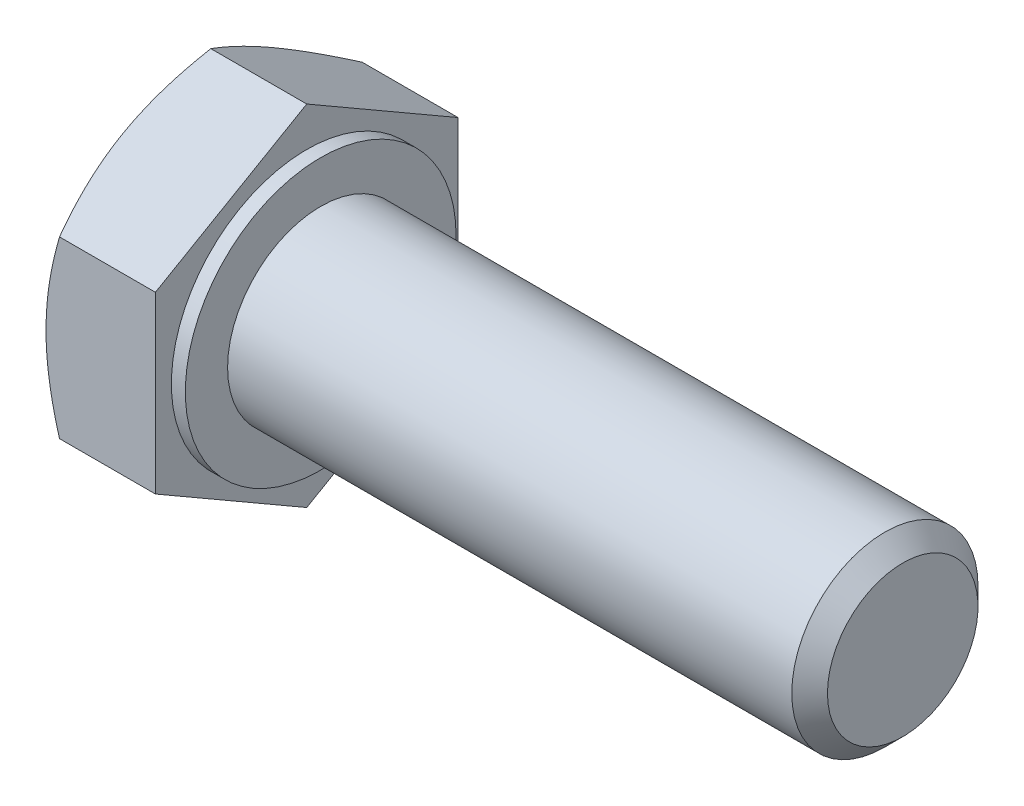
ISO-10303-21;
HEADER;
FILE_DESCRIPTION(('STEP AP214'),'2;1');
FILE_NAME('part.step','',(''),(''),'','','');
FILE_SCHEMA(('AUTOMOTIVE_DESIGN { 1 0 10303 214 1 1 1 1 }'));
ENDSEC;
DATA;
#1=APPLICATION_CONTEXT('core data for automotive mechanical design processes');
#2=APPLICATION_PROTOCOL_DEFINITION('international standard','automotive_design',2000,#1);
#3=PRODUCT_CONTEXT('',#1,'mechanical');
#4=PRODUCT('Part','Part','',(#3));
#5=PRODUCT_RELATED_PRODUCT_CATEGORY('part','',(#4));
#6=PRODUCT_DEFINITION_FORMATION('','',#4);
#7=PRODUCT_DEFINITION_CONTEXT('part definition',#1,'design');
#8=PRODUCT_DEFINITION('design','',#6,#7);
#9=PRODUCT_DEFINITION_SHAPE('','',#8);
#10=(LENGTH_UNIT() NAMED_UNIT(*) SI_UNIT(.MILLI.,.METRE.));
#11=(NAMED_UNIT(*) PLANE_ANGLE_UNIT() SI_UNIT($,.RADIAN.));
#12=(NAMED_UNIT(*) SI_UNIT($,.STERADIAN.) SOLID_ANGLE_UNIT());
#13=UNCERTAINTY_MEASURE_WITH_UNIT(LENGTH_MEASURE(1.E-05),#10,'distance_accuracy_value','');
#14=(GEOMETRIC_REPRESENTATION_CONTEXT(3) GLOBAL_UNCERTAINTY_ASSIGNED_CONTEXT((#13)) GLOBAL_UNIT_ASSIGNED_CONTEXT((#10,
#11,#12)) REPRESENTATION_CONTEXT('',''));
#15=CARTESIAN_POINT('',(0.,0.,0.));
#16=DIRECTION('',(0.,0.,1.));
#17=DIRECTION('',(1.,0.,0.));
#18=AXIS2_PLACEMENT_3D('',#15,#16,#17);
#19=CARTESIAN_POINT('',(25.,2.,0.));
#20=DIRECTION('',(1.,0.,0.));
#21=DIRECTION('',(0.,0.,-1.));
#22=AXIS2_PLACEMENT_3D('',#19,#20,#21);
#23=PLANE('',#22);
#24=CARTESIAN_POINT('',(25.0000000003184,0.,0.));
#25=DIRECTION('',(-1.,0.,0.));
#26=DIRECTION('',(0.,0.,1.));
#27=AXIS2_PLACEMENT_3D('',#24,#25,#26);
#28=CIRCLE('',#27,3.23318750037059);
#29=CARTESIAN_POINT('',(25.0000000003184,0.,3.23318750037059));
#30=VERTEX_POINT('',#29);
#31=EDGE_CURVE('E20',#30,#30,#28,.T.);
#32=ORIENTED_EDGE('',*,*,#31,.F.);
#33=EDGE_LOOP('',(#32));
#34=FACE_BOUND('',#33,.T.);
#35=ADVANCED_FACE('F16',(#34),#23,.T.);
#36=CARTESIAN_POINT('',(24.2330874998515,0.,0.));
#37=DIRECTION('',(-1.,0.,0.));
#38=DIRECTION('',(0.,0.,1.));
#39=AXIS2_PLACEMENT_3D('',#36,#37,#38);
#40=CONICAL_SURFACE('',#39,3.99999999945067,0.785332961756607);
#41=ORIENTED_EDGE('',*,*,#31,.T.);
#42=EDGE_LOOP('',(#41));
#43=FACE_BOUND('',#42,.T.);
#44=CARTESIAN_POINT('',(24.2330875,0.,0.));
#45=DIRECTION('',(1.,0.,0.));
#46=DIRECTION('',(0.,1.,0.));
#47=AXIS2_PLACEMENT_3D('',#44,#45,#46);
#48=CIRCLE('',#47,4.);
#49=CARTESIAN_POINT('',(24.2330875,4.,0.));
#50=VERTEX_POINT('',#49);
#51=EDGE_CURVE('E115',#50,#50,#48,.F.);
#52=ORIENTED_EDGE('',*,*,#51,.F.);
#53=EDGE_LOOP('',(#52));
#54=FACE_BOUND('',#53,.T.);
#55=ADVANCED_FACE('F290',(#43,#54),#40,.T.);
#56=CARTESIAN_POINT('',(-5.3001,0.,0.));
#57=DIRECTION('',(1.,0.,0.));
#58=DIRECTION('',(0.,0.,-1.));
#59=AXIS2_PLACEMENT_3D('',#56,#57,#58);
#60=PLANE('',#59);
#61=CARTESIAN_POINT('',(-5.30010000060163,0.,0.));
#62=DIRECTION('',(1.,0.,0.));
#63=DIRECTION('',(0.,0.,-1.));
#64=AXIS2_PLACEMENT_3D('',#61,#62,#63);
#65=CIRCLE('',#64,6.50000000034734);
#66=CARTESIAN_POINT('',(-5.3001000007019,5.62916512474925,-3.25000000008683));
#67=VERTEX_POINT('',#66);
#68=CARTESIAN_POINT('',(-5.3001000007019,5.62916512474925,3.25000000008684));
#69=VERTEX_POINT('',#68);
#70=EDGE_CURVE('E309',#67,#69,#65,.T.);
#71=ORIENTED_EDGE('',*,*,#70,.F.);
#72=CARTESIAN_POINT('',(-5.30010000060163,0.,0.));
#73=DIRECTION('',(1.,0.,0.));
#74=DIRECTION('',(0.,0.,-1.));
#75=AXIS2_PLACEMENT_3D('',#72,#73,#74);
#76=CIRCLE('',#75,6.50000000034734);
#77=CARTESIAN_POINT('',(-5.3001000007019,0.,-6.50000000017367));
#78=VERTEX_POINT('',#77);
#79=EDGE_CURVE('E310',#78,#67,#76,.T.);
#80=ORIENTED_EDGE('',*,*,#79,.F.);
#81=CARTESIAN_POINT('',(-5.30010000060163,0.,0.));
#82=DIRECTION('',(1.,0.,0.));
#83=DIRECTION('',(0.,0.,-1.));
#84=AXIS2_PLACEMENT_3D('',#81,#82,#83);
#85=CIRCLE('',#84,6.50000000034734);
#86=CARTESIAN_POINT('',(-5.3001000007019,-5.62916512474926,-3.25000000008683));
#87=VERTEX_POINT('',#86);
#88=EDGE_CURVE('E315',#87,#78,#85,.T.);
#89=ORIENTED_EDGE('',*,*,#88,.F.);
#90=CARTESIAN_POINT('',(-5.30010000060163,0.,0.));
#91=DIRECTION('',(1.,0.,0.));
#92=DIRECTION('',(0.,0.,-1.));
#93=AXIS2_PLACEMENT_3D('',#90,#91,#92);
#94=CIRCLE('',#93,6.50000000034735);
#95=CARTESIAN_POINT('',(-5.3001000007019,-5.62916512474926,3.25000000008683));
#96=VERTEX_POINT('',#95);
#97=EDGE_CURVE('E93',#96,#87,#94,.T.);
#98=ORIENTED_EDGE('',*,*,#97,.F.);
#99=CARTESIAN_POINT('',(-5.30010000060163,0.,0.));
#100=DIRECTION('',(1.,0.,0.));
#101=DIRECTION('',(0.,0.,-1.));
#102=AXIS2_PLACEMENT_3D('',#99,#100,#101);
#103=CIRCLE('',#102,6.50000000034734);
#104=CARTESIAN_POINT('',(-5.3001000007019,0.,6.50000000017367));
#105=VERTEX_POINT('',#104);
#106=EDGE_CURVE('E89',#105,#96,#103,.T.);
#107=ORIENTED_EDGE('',*,*,#106,.F.);
#108=CARTESIAN_POINT('',(-5.30010000060163,0.,0.));
#109=DIRECTION('',(1.,0.,0.));
#110=DIRECTION('',(0.,0.,-1.));
#111=AXIS2_PLACEMENT_3D('',#108,#109,#110);
#112=CIRCLE('',#111,6.50000000034734);
#113=EDGE_CURVE('E86',#69,#105,#112,.T.);
#114=ORIENTED_EDGE('',*,*,#113,.F.);
#115=EDGE_LOOP('',(#71,#80,#89,#98,#107,#114));
#116=FACE_BOUND('',#115,.T.);
#117=ADVANCED_FACE('F91',(#116),#60,.F.);
#118=CARTESIAN_POINT('',(0.,0.,0.));
#119=DIRECTION('',(1.,0.,0.));
#120=DIRECTION('',(0.,1.,0.));
#121=AXIS2_PLACEMENT_3D('',#118,#119,#120);
#122=CYLINDRICAL_SURFACE('',#121,4.);
#123=ORIENTED_EDGE('',*,*,#51,.T.);
#124=EDGE_LOOP('',(#123));
#125=FACE_BOUND('',#124,.T.);
#126=CARTESIAN_POINT('',(0.,0.,0.));
#127=DIRECTION('',(1.,0.,0.));
#128=DIRECTION('',(0.,1.,0.));
#129=AXIS2_PLACEMENT_3D('',#126,#127,#128);
#130=CIRCLE('',#129,4.);
#131=CARTESIAN_POINT('',(0.,4.,0.));
#132=VERTEX_POINT('',#131);
#133=EDGE_CURVE('E308',#132,#132,#130,.F.);
#134=ORIENTED_EDGE('',*,*,#133,.F.);
#135=EDGE_LOOP('',(#134));
#136=FACE_BOUND('',#135,.T.);
#137=ADVANCED_FACE('F144',(#125,#136),#122,.T.);
#138=CARTESIAN_POINT('',(-4.71606007628881,0.,0.));
#139=DIRECTION('',(1.,0.,0.));
#140=DIRECTION('',(0.,0.,-1.));
#141=AXIS2_PLACEMENT_3D('',#138,#139,#140);
#142=CONICAL_SURFACE('',#141,7.51158682011039,1.04719755);
#143=ORIENTED_EDGE('',*,*,#113,.T.);
#144=CARTESIAN_POINT('',(-4.71954341574839,3.75277674954465,6.50000000014825));
#145=CARTESIAN_POINT('',(-4.80774841042682,3.44730232112219,6.50000000005178));
#146=CARTESIAN_POINT('',(-4.8885595851036,3.13938154370029,6.50000000001353));
#147=CARTESIAN_POINT('',(-5.03106863668347,2.52082569763931,6.49999999998653));
#148=CARTESIAN_POINT('',(-5.09286102468761,2.2102122047861,6.49999999999753));
#149=CARTESIAN_POINT('',(-5.16873158616212,1.74136052795637,6.50000000000123));
#150=CARTESIAN_POINT('',(-5.19122798005171,1.58448437567682,6.50000000000033));
#151=CARTESIAN_POINT('',(-5.23016970682356,1.26998104102713,6.49999999999967));
#152=CARTESIAN_POINT('',(-5.24661519897016,1.11235387853477,6.4999999999999));
#153=CARTESIAN_POINT('',(-5.27316617523848,0.795765480090369,6.5000000000001));
#154=CARTESIAN_POINT('',(-5.28323941771858,0.636801519371177,6.50000000000005));
#155=CARTESIAN_POINT('',(-5.29672027318267,0.318560967305241,6.49999999999995));
#156=CARTESIAN_POINT('',(-5.30012656605982,0.159284320292753,6.4999999999999));
#157=CARTESIAN_POINT('',(-5.30010000080217,1.44690060205098E-11,6.5));
#158=B_SPLINE_CURVE_WITH_KNOTS('',3,(#144,#145,#146,#147,#148,#149,#150,#151,#152,#153,#154,
#155,#156,#157),.UNSPECIFIED.,.F.,.F.,(4,2,2,2,2,2,4),(0.,0.95424765593265,1.90367376216702,
2.37900973804997,2.85433320183383,3.33204281632236,3.80984701139079),.UNSPECIFIED.);
#159=CARTESIAN_POINT('',(-4.71954341565879,3.75277674967911,6.49999999990745));
#160=VERTEX_POINT('',#159);
#161=EDGE_CURVE('E112',#160,#105,#158,.T.);
#162=ORIENTED_EDGE('',*,*,#161,.F.);
#163=CARTESIAN_POINT('',(-5.30010000075204,5.62916512452364,3.24999999995658));
#164=CARTESIAN_POINT('',(-5.30012656604207,5.54952296443118,3.38794426777257));
#165=CARTESIAN_POINT('',(-5.29672027317816,5.4698846409434,3.52588189032867));
#166=CARTESIAN_POINT('',(-5.28323941772366,5.31076436492274,3.80148629294424));
#167=CARTESIAN_POINT('',(-5.27316617523994,5.231282384557,3.93915312121167));
#168=CARTESIAN_POINT('',(-5.24661519896896,5.07298818532964,4.21332671680797));
#169=CARTESIAN_POINT('',(-5.23016970682335,4.99417460408441,4.34983584385439));
#170=CARTESIAN_POINT('',(-5.19122798005152,4.8369229367597,4.62220372123815));
#171=CARTESIAN_POINT('',(-5.16873158616096,4.75848486061912,4.75806245436081));
#172=CARTESIAN_POINT('',(-5.09286102468758,4.52405902220162,5.16409991710552));
#173=CARTESIAN_POINT('',(-5.03106863668958,4.36875227577312,5.43309909267835));
#174=CARTESIAN_POINT('',(-4.88855958509157,4.059474352742,5.96878416902851));
#175=CARTESIAN_POINT('',(-4.80774841039025,3.90551396403236,6.23545138462711));
#176=CARTESIAN_POINT('',(-4.71954341565132,3.7527767498265,6.49999999983729));
#177=B_SPLINE_CURVE_WITH_KNOTS('',3,(#163,#164,#165,#166,#167,#168,#169,#170,#171,#172,#173,
#174,#175,#176),.UNSPECIFIED.,.F.,.F.,(4,2,2,2,2,2,4),(0.,0.477804195075441,0.955513809569312,
1.43083727335572,1.90617324924196,2.85559935548388,3.80984701142868),.UNSPECIFIED.);
#178=EDGE_CURVE('E106',#69,#160,#177,.T.);
#179=ORIENTED_EDGE('',*,*,#178,.F.);
#180=EDGE_LOOP('',(#143,#162,#179));
#181=FACE_BOUND('',#180,.T.);
#182=ADVANCED_FACE('F111',(#181),#142,.T.);
#183=CARTESIAN_POINT('',(-4.71606007628881,0.,0.));
#184=DIRECTION('',(1.,0.,0.));
#185=DIRECTION('',(0.,0.,-1.));
#186=AXIS2_PLACEMENT_3D('',#183,#184,#185);
#187=CONICAL_SURFACE('',#186,7.51158682011039,1.04719755);
#188=CARTESIAN_POINT('',(-5.30010000075204,0.,6.49999999991316));
#189=CARTESIAN_POINT('',(-5.30012656604206,-0.159284320281323,6.49999999996882));
#190=CARTESIAN_POINT('',(-5.29672027317816,-0.318560967296424,6.49999999999164));
#191=CARTESIAN_POINT('',(-5.28323941772365,-0.63680151936667,6.50000000000835));
#192=CARTESIAN_POINT('',(-5.27316617523994,-0.79576548008756,6.50000000000224));
#193=CARTESIAN_POINT('',(-5.24661519896896,-1.11235387853455,6.49999999999777));
#194=CARTESIAN_POINT('',(-5.23016970682335,-1.26998104102781,6.49999999999939));
#195=CARTESIAN_POINT('',(-5.19122798005152,-1.58448437567934,6.50000000000061));
#196=CARTESIAN_POINT('',(-5.16873158616096,-1.74136052795982,6.50000000000022));
#197=CARTESIAN_POINT('',(-5.09286102468758,-2.21021220479367,6.49999999999956));
#198=CARTESIAN_POINT('',(-5.03106863668958,-2.52082569765106,6.49999999999978));
#199=CARTESIAN_POINT('',(-4.88855958509157,-3.13938154371405,6.50000000000022));
#200=CARTESIAN_POINT('',(-4.80774841039026,-3.44730232113372,6.50000000000045));
#201=CARTESIAN_POINT('',(-4.71954341565133,-3.75277674954466,6.5));
#202=B_SPLINE_CURVE_WITH_KNOTS('',3,(#188,#189,#190,#191,#192,#193,#194,#195,#196,#197,#198,
#199,#200,#201),.UNSPECIFIED.,.F.,.F.,(4,2,2,2,2,2,4),(0.,0.477804195075437,0.955513809569304,
1.43083727335571,1.90617324924194,2.85559935548386,3.80984701142866),.UNSPECIFIED.);
#203=CARTESIAN_POINT('',(-4.71954341565879,-3.75277674967912,6.49999999990744));
#204=VERTEX_POINT('',#203);
#205=EDGE_CURVE('E99',#105,#204,#202,.T.);
#206=ORIENTED_EDGE('',*,*,#205,.F.);
#207=ORIENTED_EDGE('',*,*,#106,.T.);
#208=CARTESIAN_POINT('',(-4.71954341574838,-3.75277674995489,6.49999999991141));
#209=CARTESIAN_POINT('',(-4.80774841042681,-3.90551396408259,6.23545138464279));
#210=CARTESIAN_POINT('',(-4.8885595851036,-4.05947435276042,5.96878416902325));
#211=CARTESIAN_POINT('',(-5.03106863668346,-4.36875227576753,5.43309909266156));
#212=CARTESIAN_POINT('',(-5.09286102468761,-4.52405902220366,5.16409991709796));
#213=CARTESIAN_POINT('',(-5.16873158616211,-4.75848486062173,4.75806245435833));
#214=CARTESIAN_POINT('',(-5.19122798005171,-4.83692293676072,4.62220372123583));
#215=CARTESIAN_POINT('',(-5.23016970682356,-4.994174604085,4.34983584385394));
#216=CARTESIAN_POINT('',(-5.24661519897015,-5.07298818533138,4.21332671680922));
#217=CARTESIAN_POINT('',(-5.27316617523848,-5.23128238455375,3.93915312121304));
#218=CARTESIAN_POINT('',(-5.28323941771858,-5.3107643649133,3.801486292944));
#219=CARTESIAN_POINT('',(-5.29672027318267,-5.46988464094619,3.52588189034046));
#220=CARTESIAN_POINT('',(-5.30012656605982,-5.54952296445239,3.38794426779802));
#221=CARTESIAN_POINT('',(-5.30010000080218,-5.62916512459161,3.25000000001253));
#222=B_SPLINE_CURVE_WITH_KNOTS('',3,(#208,#209,#210,#211,#212,#213,#214,#215,#216,#217,#218,
#219,#220,#221),.UNSPECIFIED.,.F.,.F.,(4,2,2,2,2,2,4),(0.,0.954247655932657,1.90367376216704,
2.37900973804999,2.85433320183385,3.33204281632239,3.80984701139082),.UNSPECIFIED.);
#223=EDGE_CURVE('E101',#204,#96,#222,.T.);
#224=ORIENTED_EDGE('',*,*,#223,.F.);
#225=EDGE_LOOP('',(#206,#207,#224));
#226=FACE_BOUND('',#225,.T.);
#227=ADVANCED_FACE('F100',(#226),#187,.T.);
#228=CARTESIAN_POINT('',(-4.71606007628881,0.,0.));
#229=DIRECTION('',(1.,0.,0.));
#230=DIRECTION('',(0.,0.,-1.));
#231=AXIS2_PLACEMENT_3D('',#228,#229,#230);
#232=CONICAL_SURFACE('',#231,7.51158682011039,1.04719755);
#233=CARTESIAN_POINT('',(-5.30010000075204,-5.62916512452365,3.24999999995657));
#234=CARTESIAN_POINT('',(-5.30012656604206,-5.70880728471251,3.11205573219625));
#235=CARTESIAN_POINT('',(-5.29672027317815,-5.78844560823983,2.97411810966298));
#236=CARTESIAN_POINT('',(-5.28323941772365,-5.94756588428942,2.69851370706411));
#237=CARTESIAN_POINT('',(-5.27316617523994,-6.02704786464457,2.56084687879057));
#238=CARTESIAN_POINT('',(-5.24661519896896,-6.1853420638642,2.28667328318981));
#239=CARTESIAN_POINT('',(-5.23016970682335,-6.26415564511223,2.15016415614501));
#240=CARTESIAN_POINT('',(-5.19122798005152,-6.42140731243905,1.87779627876247));
#241=CARTESIAN_POINT('',(-5.16873158616096,-6.49984538857896,1.74193754563942));
#242=CARTESIAN_POINT('',(-5.09286102468758,-6.7342712269953,1.33590008289405));
#243=CARTESIAN_POINT('',(-5.03106863668958,-6.88957797342419,1.06690090732145));
#244=CARTESIAN_POINT('',(-4.88855958509157,-7.19885589645607,0.531215830971735));
#245=CARTESIAN_POINT('',(-4.80774841039026,-7.3528162851661,0.26454861537336));
#246=CARTESIAN_POINT('',(-4.71954341565133,-7.50555349937118,1.62726149552428E-10));
#247=B_SPLINE_CURVE_WITH_KNOTS('',3,(#233,#234,#235,#236,#237,#238,#239,#240,#241,#242,#243,
#244,#245,#246),.UNSPECIFIED.,.F.,.F.,(4,2,2,2,2,2,4),(0.,0.477804195075437,0.955513809569304,
1.43083727335571,1.90617324924194,2.85559935548386,3.80984701142866),.UNSPECIFIED.);
#248=CARTESIAN_POINT('',(-4.71954341565879,-7.50555349935825,0.));
#249=VERTEX_POINT('',#248);
#250=EDGE_CURVE('E118',#96,#249,#247,.T.);
#251=ORIENTED_EDGE('',*,*,#250,.F.);
#252=ORIENTED_EDGE('',*,*,#97,.T.);
#253=CARTESIAN_POINT('',(-4.71954341574838,-7.50555349949957,-2.36832529609976E-10));
#254=CARTESIAN_POINT('',(-4.80774841042681,-7.3528162852048,-0.264548615408993));
#255=CARTESIAN_POINT('',(-4.8885595851036,-7.19885589646073,-0.531215830990284));
#256=CARTESIAN_POINT('',(-5.03106863668347,-6.88957797340685,-1.06690090732498));
#257=CARTESIAN_POINT('',(-5.09286102468761,-6.73427122698977,-1.33590008289957));
#258=CARTESIAN_POINT('',(-5.16873158616212,-6.49984538857811,-1.7419375456429));
#259=CARTESIAN_POINT('',(-5.19122798005171,-6.42140731243756,-1.8777962787645));
#260=CARTESIAN_POINT('',(-5.23016970682356,-6.26415564511213,-2.15016415614572));
#261=CARTESIAN_POINT('',(-5.24661519897015,-6.18534206386616,-2.28667328319068));
#262=CARTESIAN_POINT('',(-5.27316617523848,-6.02704786464412,-2.56084687878706));
#263=CARTESIAN_POINT('',(-5.28323941771858,-5.94756588428448,-2.69851370705605));
#264=CARTESIAN_POINT('',(-5.29672027318267,-5.78844560825143,-2.97411810965949));
#265=CARTESIAN_POINT('',(-5.30012656605982,-5.70880728474515,-3.11205573220189));
#266=CARTESIAN_POINT('',(-5.30010000080217,-5.62916512460609,-3.24999999998747));
#267=B_SPLINE_CURVE_WITH_KNOTS('',3,(#253,#254,#255,#256,#257,#258,#259,#260,#261,#262,#263,
#264,#265,#266),.UNSPECIFIED.,.F.,.F.,(4,2,2,2,2,2,4),(0.,0.954247655932657,1.90367376216704,
2.37900973804999,2.85433320183385,3.33204281632239,3.80984701139082),.UNSPECIFIED.);
#268=EDGE_CURVE('E265',#249,#87,#267,.T.);
#269=ORIENTED_EDGE('',*,*,#268,.F.);
#270=EDGE_LOOP('',(#251,#252,#269));
#271=FACE_BOUND('',#270,.T.);
#272=ADVANCED_FACE('F319',(#271),#232,.T.);
#273=CARTESIAN_POINT('',(-4.71606007628881,0.,0.));
#274=DIRECTION('',(1.,0.,0.));
#275=DIRECTION('',(0.,0.,-1.));
#276=AXIS2_PLACEMENT_3D('',#273,#274,#275);
#277=CONICAL_SURFACE('',#276,7.51158682011039,1.04719755);
#278=CARTESIAN_POINT('',(-5.30010000075204,-5.62916512452365,-3.24999999995658));
#279=CARTESIAN_POINT('',(-5.30012656604207,-5.54952296443119,-3.38794426777257));
#280=CARTESIAN_POINT('',(-5.29672027317816,-5.46988464094341,-3.52588189032866));
#281=CARTESIAN_POINT('',(-5.28323941772366,-5.31076436492275,-3.80148629294423));
#282=CARTESIAN_POINT('',(-5.27316617523994,-5.23128238455701,-3.93915312121166));
#283=CARTESIAN_POINT('',(-5.24661519896896,-5.07298818532965,-4.21332671680795));
#284=CARTESIAN_POINT('',(-5.23016970682335,-4.99417460408442,-4.34983584385438));
#285=CARTESIAN_POINT('',(-5.19122798005152,-4.83692293675971,-4.62220372123813));
#286=CARTESIAN_POINT('',(-5.16873158616097,-4.75848486061914,-4.75806245436079));
#287=CARTESIAN_POINT('',(-5.09286102468758,-4.52405902220163,-5.16409991710551));
#288=CARTESIAN_POINT('',(-5.03106863668958,-4.36875227577313,-5.43309909267833));
#289=CARTESIAN_POINT('',(-4.88855958509157,-4.05947435274202,-5.96878416902849));
#290=CARTESIAN_POINT('',(-4.80774841039026,-3.90551396403238,-6.23545138462709));
#291=CARTESIAN_POINT('',(-4.71954341565133,-3.75277674982652,-6.49999999983727));
#292=B_SPLINE_CURVE_WITH_KNOTS('',3,(#278,#279,#280,#281,#282,#283,#284,#285,#286,#287,#288,
#289,#290,#291),.UNSPECIFIED.,.F.,.F.,(4,2,2,2,2,2,4),(0.,0.477804195075437,0.955513809569305,
1.43083727335571,1.90617324924195,2.85559935548386,3.80984701142866),.UNSPECIFIED.);
#293=CARTESIAN_POINT('',(-4.71954341565879,-3.75277674967914,-6.49999999990743));
#294=VERTEX_POINT('',#293);
#295=EDGE_CURVE('E266',#87,#294,#292,.T.);
#296=ORIENTED_EDGE('',*,*,#295,.F.);
#297=ORIENTED_EDGE('',*,*,#88,.T.);
#298=CARTESIAN_POINT('',(-4.71954341574837,-3.75277674954469,-6.50000000014824));
#299=CARTESIAN_POINT('',(-4.8077484104268,-3.44730232112222,-6.50000000005178));
#300=CARTESIAN_POINT('',(-4.88855958510359,-3.13938154370033,-6.50000000001353));
#301=CARTESIAN_POINT('',(-5.03106863668346,-2.52082569763934,-6.49999999998653));
#302=CARTESIAN_POINT('',(-5.09286102468761,-2.21021220478613,-6.49999999999753));
#303=CARTESIAN_POINT('',(-5.16873158616212,-1.74136052795639,-6.50000000000123));
#304=CARTESIAN_POINT('',(-5.19122798005171,-1.58448437567684,-6.50000000000033));
#305=CARTESIAN_POINT('',(-5.23016970682356,-1.26998104102714,-6.49999999999967));
#306=CARTESIAN_POINT('',(-5.24661519897015,-1.11235387853478,-6.4999999999999));
#307=CARTESIAN_POINT('',(-5.27316617523848,-0.795765480090378,-6.5000000000001));
#308=CARTESIAN_POINT('',(-5.28323941771858,-0.636801519371184,-6.50000000000005));
#309=CARTESIAN_POINT('',(-5.29672027318267,-0.318560967305245,-6.49999999999995));
#310=CARTESIAN_POINT('',(-5.30012656605982,-0.159284320292756,-6.4999999999999));
#311=CARTESIAN_POINT('',(-5.30010000080217,-1.44704230713335E-11,-6.5));
#312=B_SPLINE_CURVE_WITH_KNOTS('',3,(#298,#299,#300,#301,#302,#303,#304,#305,#306,#307,#308,
#309,#310,#311),.UNSPECIFIED.,.F.,.F.,(4,2,2,2,2,2,4),(0.,0.95424765593266,1.90367376216704,
2.37900973804999,2.85433320183386,3.3320428163224,3.80984701139083),.UNSPECIFIED.);
#313=EDGE_CURVE('E273',#294,#78,#312,.T.);
#314=ORIENTED_EDGE('',*,*,#313,.F.);
#315=EDGE_LOOP('',(#296,#297,#314));
#316=FACE_BOUND('',#315,.T.);
#317=ADVANCED_FACE('F336',(#316),#277,.T.);
#318=CARTESIAN_POINT('',(-4.71606007628881,0.,0.));
#319=DIRECTION('',(1.,0.,0.));
#320=DIRECTION('',(0.,0.,-1.));
#321=AXIS2_PLACEMENT_3D('',#318,#319,#320);
#322=CONICAL_SURFACE('',#321,7.51158682011039,1.04719755);
#323=ORIENTED_EDGE('',*,*,#79,.T.);
#324=CARTESIAN_POINT('',(-4.71954341574838,3.75277674995488,-6.49999999991141));
#325=CARTESIAN_POINT('',(-4.80774841042681,3.90551396408258,-6.23545138464279));
#326=CARTESIAN_POINT('',(-4.8885595851036,4.05947435276041,-5.96878416902325));
#327=CARTESIAN_POINT('',(-5.03106863668347,4.36875227576752,-5.43309909266156));
#328=CARTESIAN_POINT('',(-5.09286102468761,4.52405902220365,-5.16409991709796));
#329=CARTESIAN_POINT('',(-5.16873158616212,4.75848486062172,-4.75806245435833));
#330=CARTESIAN_POINT('',(-5.19122798005171,4.83692293676072,-4.62220372123583));
#331=CARTESIAN_POINT('',(-5.23016970682356,4.99417460408499,-4.34983584385394));
#332=CARTESIAN_POINT('',(-5.24661519897016,5.07298818533137,-4.21332671680922));
#333=CARTESIAN_POINT('',(-5.27316617523848,5.23128238455374,-3.93915312121303));
#334=CARTESIAN_POINT('',(-5.28323941771858,5.3107643649133,-3.801486292944));
#335=CARTESIAN_POINT('',(-5.29672027318267,5.46988464094618,-3.52588189034046));
#336=CARTESIAN_POINT('',(-5.30012656605982,5.54952296445239,-3.38794426779801));
#337=CARTESIAN_POINT('',(-5.30010000080218,5.62916512459161,-3.25000000001253));
#338=B_SPLINE_CURVE_WITH_KNOTS('',3,(#324,#325,#326,#327,#328,#329,#330,#331,#332,#333,#334,
#335,#336,#337),.UNSPECIFIED.,.F.,.F.,(4,2,2,2,2,2,4),(0.,0.954247655932657,1.90367376216704,
2.37900973804999,2.85433320183386,3.33204281632239,3.80984701139082),.UNSPECIFIED.);
#339=CARTESIAN_POINT('',(-4.71954341565879,3.75277674967912,-6.49999999990744));
#340=VERTEX_POINT('',#339);
#341=EDGE_CURVE('E186',#340,#67,#338,.T.);
#342=ORIENTED_EDGE('',*,*,#341,.F.);
#343=CARTESIAN_POINT('',(-5.30010000075204,0.,-6.49999999991316));
#344=CARTESIAN_POINT('',(-5.30012656604207,0.15928432028132,-6.49999999996882));
#345=CARTESIAN_POINT('',(-5.29672027317816,0.318560967296422,-6.49999999999164));
#346=CARTESIAN_POINT('',(-5.28323941772366,0.636801519366667,-6.50000000000835));
#347=CARTESIAN_POINT('',(-5.27316617523994,0.795765480087557,-6.50000000000224));
#348=CARTESIAN_POINT('',(-5.24661519896896,1.11235387853455,-6.49999999999777));
#349=CARTESIAN_POINT('',(-5.23016970682335,1.26998104102781,-6.49999999999939));
#350=CARTESIAN_POINT('',(-5.19122798005152,1.58448437567934,-6.50000000000061));
#351=CARTESIAN_POINT('',(-5.16873158616096,1.74136052795982,-6.50000000000022));
#352=CARTESIAN_POINT('',(-5.09286102468758,2.21021220479367,-6.49999999999956));
#353=CARTESIAN_POINT('',(-5.03106863668958,2.52082569765105,-6.49999999999978));
#354=CARTESIAN_POINT('',(-4.88855958509157,3.13938154371405,-6.50000000000022));
#355=CARTESIAN_POINT('',(-4.80774841039026,3.44730232113372,-6.50000000000045));
#356=CARTESIAN_POINT('',(-4.71954341565133,3.75277674954466,-6.5));
#357=B_SPLINE_CURVE_WITH_KNOTS('',3,(#343,#344,#345,#346,#347,#348,#349,#350,#351,#352,#353,
#354,#355,#356),.UNSPECIFIED.,.F.,.F.,(4,2,2,2,2,2,4),(0.,0.477804195075437,0.955513809569304,
1.43083727335571,1.90617324924194,2.85559935548386,3.80984701142865),.UNSPECIFIED.);
#358=EDGE_CURVE('E274',#78,#340,#357,.T.);
#359=ORIENTED_EDGE('',*,*,#358,.F.);
#360=EDGE_LOOP('',(#323,#342,#359));
#361=FACE_BOUND('',#360,.T.);
#362=ADVANCED_FACE('F171',(#361),#322,.T.);
#363=CARTESIAN_POINT('',(-4.71606007628881,0.,0.));
#364=DIRECTION('',(1.,0.,0.));
#365=DIRECTION('',(0.,0.,-1.));
#366=AXIS2_PLACEMENT_3D('',#363,#364,#365);
#367=CONICAL_SURFACE('',#366,7.51158682011039,1.04719755);
#368=ORIENTED_EDGE('',*,*,#70,.T.);
#369=CARTESIAN_POINT('',(-4.71954341574838,7.50555349949957,2.36845292418576E-10));
#370=CARTESIAN_POINT('',(-4.80774841042681,7.3528162852048,0.264548615409003));
#371=CARTESIAN_POINT('',(-4.8885595851036,7.19885589646072,0.531215830990293));
#372=CARTESIAN_POINT('',(-5.03106863668347,6.88957797340685,1.06690090732498));
#373=CARTESIAN_POINT('',(-5.09286102468761,6.73427122698977,1.33590008289958));
#374=CARTESIAN_POINT('',(-5.16873158616212,6.49984538857811,1.74193754564291));
#375=CARTESIAN_POINT('',(-5.19122798005171,6.42140731243755,1.8777962787645));
#376=CARTESIAN_POINT('',(-5.23016970682356,6.26415564511213,2.15016415614573));
#377=CARTESIAN_POINT('',(-5.24661519897016,6.18534206386615,2.28667328319069));
#378=CARTESIAN_POINT('',(-5.27316617523848,6.02704786464412,2.56084687878707));
#379=CARTESIAN_POINT('',(-5.28323941771858,5.94756588428448,2.69851370705606));
#380=CARTESIAN_POINT('',(-5.29672027318267,5.78844560825143,2.97411810965949));
#381=CARTESIAN_POINT('',(-5.30012656605982,5.70880728474514,3.11205573220189));
#382=CARTESIAN_POINT('',(-5.30010000080218,5.62916512460608,3.24999999998747));
#383=B_SPLINE_CURVE_WITH_KNOTS('',3,(#369,#370,#371,#372,#373,#374,#375,#376,#377,#378,#379,
#380,#381,#382),.UNSPECIFIED.,.F.,.F.,(4,2,2,2,2,2,4),(0.,0.954247655932656,1.90367376216703,
2.37900973804998,2.85433320183385,3.33204281632238,3.80984701139081),.UNSPECIFIED.);
#384=CARTESIAN_POINT('',(-4.71954341562794,7.50555349941169,9.25588492147801E-11));
#385=VERTEX_POINT('',#384);
#386=EDGE_CURVE('E152',#385,#69,#383,.T.);
#387=ORIENTED_EDGE('',*,*,#386,.F.);
#388=CARTESIAN_POINT('',(-5.30010000075204,5.62916512452364,-3.24999999995657));
#389=CARTESIAN_POINT('',(-5.30012656604207,5.7088072847125,-3.11205573219625));
#390=CARTESIAN_POINT('',(-5.29672027317816,5.78844560823982,-2.97411810966298));
#391=CARTESIAN_POINT('',(-5.28323941772366,5.94756588428942,-2.69851370706411));
#392=CARTESIAN_POINT('',(-5.27316617523994,6.02704786464457,-2.56084687879057));
#393=CARTESIAN_POINT('',(-5.24661519896896,6.1853420638642,-2.28667328318981));
#394=CARTESIAN_POINT('',(-5.23016970682335,6.26415564511222,-2.150164156145));
#395=CARTESIAN_POINT('',(-5.19122798005152,6.42140731243905,-1.87779627876247));
#396=CARTESIAN_POINT('',(-5.16873158616097,6.49984538857895,-1.74193754563942));
#397=CARTESIAN_POINT('',(-5.09286102468758,6.7342712269953,-1.33590008289404));
#398=CARTESIAN_POINT('',(-5.03106863668958,6.88957797342418,-1.06690090732144));
#399=CARTESIAN_POINT('',(-4.88855958509157,7.19885589645607,-0.531215830971727));
#400=CARTESIAN_POINT('',(-4.80774841039026,7.3528162851661,-0.264548615373351));
#401=CARTESIAN_POINT('',(-4.71954341565133,7.50555349937118,-1.62716415204084E-10));
#402=B_SPLINE_CURVE_WITH_KNOTS('',3,(#388,#389,#390,#391,#392,#393,#394,#395,#396,#397,#398,
#399,#400,#401),.UNSPECIFIED.,.F.,.F.,(4,2,2,2,2,2,4),(0.,0.477804195075439,0.955513809569307,
1.43083727335571,1.90617324924195,2.85559935548387,3.80984701142867),.UNSPECIFIED.);
#403=EDGE_CURVE('E177',#67,#385,#402,.T.);
#404=ORIENTED_EDGE('',*,*,#403,.F.);
#405=EDGE_LOOP('',(#368,#387,#404));
#406=FACE_BOUND('',#405,.T.);
#407=ADVANCED_FACE('F166',(#406),#367,.T.);
#408=CARTESIAN_POINT('',(0.,4.9075,0.));
#409=DIRECTION('',(1.,0.,0.));
#410=DIRECTION('',(0.,0.,-1.));
#411=AXIS2_PLACEMENT_3D('',#408,#409,#410);
#412=PLANE('',#411);
#413=ORIENTED_EDGE('',*,*,#133,.T.);
#414=EDGE_LOOP('',(#413));
#415=FACE_BOUND('',#414,.T.);
#416=CARTESIAN_POINT('',(0.,0.,0.));
#417=DIRECTION('',(1.,0.,0.));
#418=DIRECTION('',(0.,0.,-1.));
#419=AXIS2_PLACEMENT_3D('',#416,#417,#418);
#420=CIRCLE('',#419,5.815);
#421=CARTESIAN_POINT('',(0.,0.,-5.815));
#422=VERTEX_POINT('',#421);
#423=EDGE_CURVE('E187',#422,#422,#420,.F.);
#424=ORIENTED_EDGE('',*,*,#423,.F.);
#425=EDGE_LOOP('',(#424));
#426=FACE_BOUND('',#425,.T.);
#427=ADVANCED_FACE('F162',(#415,#426),#412,.T.);
#428=CARTESIAN_POINT('',(-0.6001,7.50555349946513,0.));
#429=DIRECTION('',(0.,0.866025403784438,0.5));
#430=DIRECTION('',(0.,-0.5,0.866025403784438));
#431=AXIS2_PLACEMENT_3D('',#428,#429,#430);
#432=PLANE('',#431);
#433=DIRECTION('',(0.,-0.5,0.866025403784438));
#434=VECTOR('',#433,1.);
#435=CARTESIAN_POINT('',(-0.6001,7.50555349946513,0.));
#436=LINE('',#435,#434);
#437=CARTESIAN_POINT('',(-0.6001,7.50555349946513,0.));
#438=VERTEX_POINT('',#437);
#439=CARTESIAN_POINT('',(-0.6001,3.75277674973256,6.5));
#440=VERTEX_POINT('',#439);
#441=EDGE_CURVE('E214',#438,#440,#436,.T.);
#442=ORIENTED_EDGE('',*,*,#441,.F.);
#443=DIRECTION('',(1.,0.,0.));
#444=VECTOR('',#443,1.);
#445=CARTESIAN_POINT('',(-0.6001,7.50555349946513,0.));
#446=LINE('',#445,#444);
#447=EDGE_CURVE('E185',#385,#438,#446,.T.);
#448=ORIENTED_EDGE('',*,*,#447,.F.);
#449=ORIENTED_EDGE('',*,*,#386,.T.);
#450=ORIENTED_EDGE('',*,*,#178,.T.);
#451=DIRECTION('',(1.,0.,0.));
#452=VECTOR('',#451,1.);
#453=CARTESIAN_POINT('',(-0.6001,3.75277674973256,6.5));
#454=LINE('',#453,#452);
#455=EDGE_CURVE('E105',#440,#160,#454,.F.);
#456=ORIENTED_EDGE('',*,*,#455,.F.);
#457=EDGE_LOOP('',(#442,#448,#449,#450,#456));
#458=FACE_BOUND('',#457,.T.);
#459=ADVANCED_FACE('F158',(#458),#432,.T.);
#460=CARTESIAN_POINT('',(-0.6001,3.75277674973256,6.5));
#461=DIRECTION('',(0.,0.,1.));
#462=DIRECTION('',(1.,0.,0.));
#463=AXIS2_PLACEMENT_3D('',#460,#461,#462);
#464=PLANE('',#463);
#465=ORIENTED_EDGE('',*,*,#455,.T.);
#466=ORIENTED_EDGE('',*,*,#161,.T.);
#467=ORIENTED_EDGE('',*,*,#205,.T.);
#468=DIRECTION('',(1.,0.,0.));
#469=VECTOR('',#468,1.);
#470=CARTESIAN_POINT('',(-0.600099999999993,-3.75277674973257,6.5));
#471=LINE('',#470,#469);
#472=CARTESIAN_POINT('',(-0.600099999999993,-3.75277674973257,6.5));
#473=VERTEX_POINT('',#472);
#474=EDGE_CURVE('E120',#473,#204,#471,.F.);
#475=ORIENTED_EDGE('',*,*,#474,.F.);
#476=DIRECTION('',(0.,1.,0.));
#477=VECTOR('',#476,1.);
#478=CARTESIAN_POINT('',(-0.6001,0.,6.5));
#479=LINE('',#478,#477);
#480=EDGE_CURVE('E216',#440,#473,#479,.F.);
#481=ORIENTED_EDGE('',*,*,#480,.F.);
#482=EDGE_LOOP('',(#465,#466,#467,#475,#481));
#483=FACE_BOUND('',#482,.T.);
#484=ADVANCED_FACE('F116',(#483),#464,.T.);
#485=CARTESIAN_POINT('',(-0.600099999999993,-3.75277674973257,6.5));
#486=DIRECTION('',(0.,-0.866025403784439,0.5));
#487=DIRECTION('',(0.,-0.5,-0.866025403784439));
#488=AXIS2_PLACEMENT_3D('',#485,#486,#487);
#489=PLANE('',#488);
#490=ORIENTED_EDGE('',*,*,#474,.T.);
#491=ORIENTED_EDGE('',*,*,#223,.T.);
#492=ORIENTED_EDGE('',*,*,#250,.T.);
#493=DIRECTION('',(1.,0.,0.));
#494=VECTOR('',#493,1.);
#495=CARTESIAN_POINT('',(-0.600099999999993,-7.50555349946513,0.));
#496=LINE('',#495,#494);
#497=CARTESIAN_POINT('',(-0.600099999999993,-7.50555349946513,0.));
#498=VERTEX_POINT('',#497);
#499=EDGE_CURVE('E260',#498,#249,#496,.F.);
#500=ORIENTED_EDGE('',*,*,#499,.F.);
#501=DIRECTION('',(0.,-0.5,-0.866025403784439));
#502=VECTOR('',#501,1.);
#503=CARTESIAN_POINT('',(-0.6001,-3.75277674973257,6.5));
#504=LINE('',#503,#502);
#505=EDGE_CURVE('E244',#473,#498,#504,.T.);
#506=ORIENTED_EDGE('',*,*,#505,.F.);
#507=EDGE_LOOP('',(#490,#491,#492,#500,#506));
#508=FACE_BOUND('',#507,.T.);
#509=ADVANCED_FACE('F258',(#508),#489,.T.);
#510=CARTESIAN_POINT('',(-0.600099999999993,-7.50555349946513,0.));
#511=DIRECTION('',(0.,-0.866025403784439,-0.5));
#512=DIRECTION('',(0.,0.5,-0.866025403784439));
#513=AXIS2_PLACEMENT_3D('',#510,#511,#512);
#514=PLANE('',#513);
#515=ORIENTED_EDGE('',*,*,#499,.T.);
#516=ORIENTED_EDGE('',*,*,#268,.T.);
#517=ORIENTED_EDGE('',*,*,#295,.T.);
#518=DIRECTION('',(-1.,0.,0.));
#519=VECTOR('',#518,1.);
#520=CARTESIAN_POINT('',(-0.600099999999993,-3.75277674973256,-6.5));
#521=LINE('',#520,#519);
#522=CARTESIAN_POINT('',(-0.6001,-3.75277674973257,-6.5));
#523=VERTEX_POINT('',#522);
#524=EDGE_CURVE('E271',#523,#294,#521,.T.);
#525=ORIENTED_EDGE('',*,*,#524,.F.);
#526=DIRECTION('',(0.,0.5,-0.866025403784439));
#527=VECTOR('',#526,1.);
#528=CARTESIAN_POINT('',(-0.6001,-7.50555349946513,0.));
#529=LINE('',#528,#527);
#530=EDGE_CURVE('E237',#498,#523,#529,.T.);
#531=ORIENTED_EDGE('',*,*,#530,.F.);
#532=EDGE_LOOP('',(#515,#516,#517,#525,#531));
#533=FACE_BOUND('',#532,.T.);
#534=ADVANCED_FACE('F268',(#533),#514,.T.);
#535=CARTESIAN_POINT('',(-0.600099999999993,-3.75277674973256,-6.5));
#536=DIRECTION('',(0.,0.,-1.));
#537=DIRECTION('',(-1.,0.,0.));
#538=AXIS2_PLACEMENT_3D('',#535,#536,#537);
#539=PLANE('',#538);
#540=DIRECTION('',(0.,1.,0.));
#541=VECTOR('',#540,1.);
#542=CARTESIAN_POINT('',(-0.6001,0.,-6.5));
#543=LINE('',#542,#541);
#544=CARTESIAN_POINT('',(-0.6001,3.75277674973256,-6.5));
#545=VERTEX_POINT('',#544);
#546=EDGE_CURVE('E232',#523,#545,#543,.T.);
#547=ORIENTED_EDGE('',*,*,#546,.F.);
#548=ORIENTED_EDGE('',*,*,#524,.T.);
#549=ORIENTED_EDGE('',*,*,#313,.T.);
#550=ORIENTED_EDGE('',*,*,#358,.T.);
#551=DIRECTION('',(1.,0.,0.));
#552=VECTOR('',#551,1.);
#553=CARTESIAN_POINT('',(-0.6001,3.75277674973256,-6.5));
#554=LINE('',#553,#552);
#555=EDGE_CURVE('E35',#545,#340,#554,.F.);
#556=ORIENTED_EDGE('',*,*,#555,.F.);
#557=EDGE_LOOP('',(#547,#548,#549,#550,#556));
#558=FACE_BOUND('',#557,.T.);
#559=ADVANCED_FACE('F197',(#558),#539,.T.);
#560=CARTESIAN_POINT('',(-0.6001,3.75277674973256,-6.5));
#561=DIRECTION('',(0.,0.866025403784439,-0.5));
#562=DIRECTION('',(0.,0.5,0.866025403784439));
#563=AXIS2_PLACEMENT_3D('',#560,#561,#562);
#564=PLANE('',#563);
#565=DIRECTION('',(0.,0.5,0.866025403784439));
#566=VECTOR('',#565,1.);
#567=CARTESIAN_POINT('',(-0.6001,3.75277674973256,-6.5));
#568=LINE('',#567,#566);
#569=EDGE_CURVE('E26',#545,#438,#568,.T.);
#570=ORIENTED_EDGE('',*,*,#569,.F.);
#571=ORIENTED_EDGE('',*,*,#555,.T.);
#572=ORIENTED_EDGE('',*,*,#341,.T.);
#573=ORIENTED_EDGE('',*,*,#403,.T.);
#574=ORIENTED_EDGE('',*,*,#447,.T.);
#575=EDGE_LOOP('',(#570,#571,#572,#573,#574));
#576=FACE_BOUND('',#575,.T.);
#577=ADVANCED_FACE('F192',(#576),#564,.T.);
#578=CARTESIAN_POINT('',(-0.6001,0.,0.));
#579=DIRECTION('',(1.,0.,0.));
#580=DIRECTION('',(0.,0.,-1.));
#581=AXIS2_PLACEMENT_3D('',#578,#579,#580);
#582=CYLINDRICAL_SURFACE('',#581,5.815);
#583=CARTESIAN_POINT('',(-0.6001,0.,0.));
#584=DIRECTION('',(1.,0.,0.));
#585=DIRECTION('',(0.,0.,-1.));
#586=AXIS2_PLACEMENT_3D('',#583,#584,#585);
#587=CIRCLE('',#586,5.815);
#588=CARTESIAN_POINT('',(-0.6001,0.,-5.815));
#589=VERTEX_POINT('',#588);
#590=EDGE_CURVE('E11',#589,#589,#587,.F.);
#591=ORIENTED_EDGE('',*,*,#590,.F.);
#592=EDGE_LOOP('',(#591));
#593=FACE_BOUND('',#592,.T.);
#594=ORIENTED_EDGE('',*,*,#423,.T.);
#595=EDGE_LOOP('',(#594));
#596=FACE_BOUND('',#595,.T.);
#597=ADVANCED_FACE('F196',(#593,#596),#582,.T.);
#598=CARTESIAN_POINT('',(-0.6001,0.,0.));
#599=DIRECTION('',(1.,0.,0.));
#600=DIRECTION('',(0.,0.,-1.));
#601=AXIS2_PLACEMENT_3D('',#598,#599,#600);
#602=PLANE('',#601);
#603=ORIENTED_EDGE('',*,*,#590,.T.);
#604=EDGE_LOOP('',(#603));
#605=FACE_BOUND('',#604,.T.);
#606=ORIENTED_EDGE('',*,*,#546,.T.);
#607=ORIENTED_EDGE('',*,*,#569,.T.);
#608=ORIENTED_EDGE('',*,*,#441,.T.);
#609=ORIENTED_EDGE('',*,*,#480,.T.);
#610=ORIENTED_EDGE('',*,*,#505,.T.);
#611=ORIENTED_EDGE('',*,*,#530,.T.);
#612=EDGE_LOOP('',(#606,#607,#608,#609,#610,#611));
#613=FACE_BOUND('',#612,.T.);
#614=ADVANCED_FACE('F18',(#605,#613),#602,.T.);
#615=CLOSED_SHELL('',(#35,#55,#117,#137,#182,#227,#272,#317,#362,#407,#427,#459,#484,#509,#534,
#559,#577,#597,#614));
#616=MANIFOLD_SOLID_BREP('B1',#615);
#617=ADVANCED_BREP_SHAPE_REPRESENTATION('',(#18,#616),#14);
#618=SHAPE_DEFINITION_REPRESENTATION(#9,#617);
ENDSEC;
END-ISO-10303-21;
